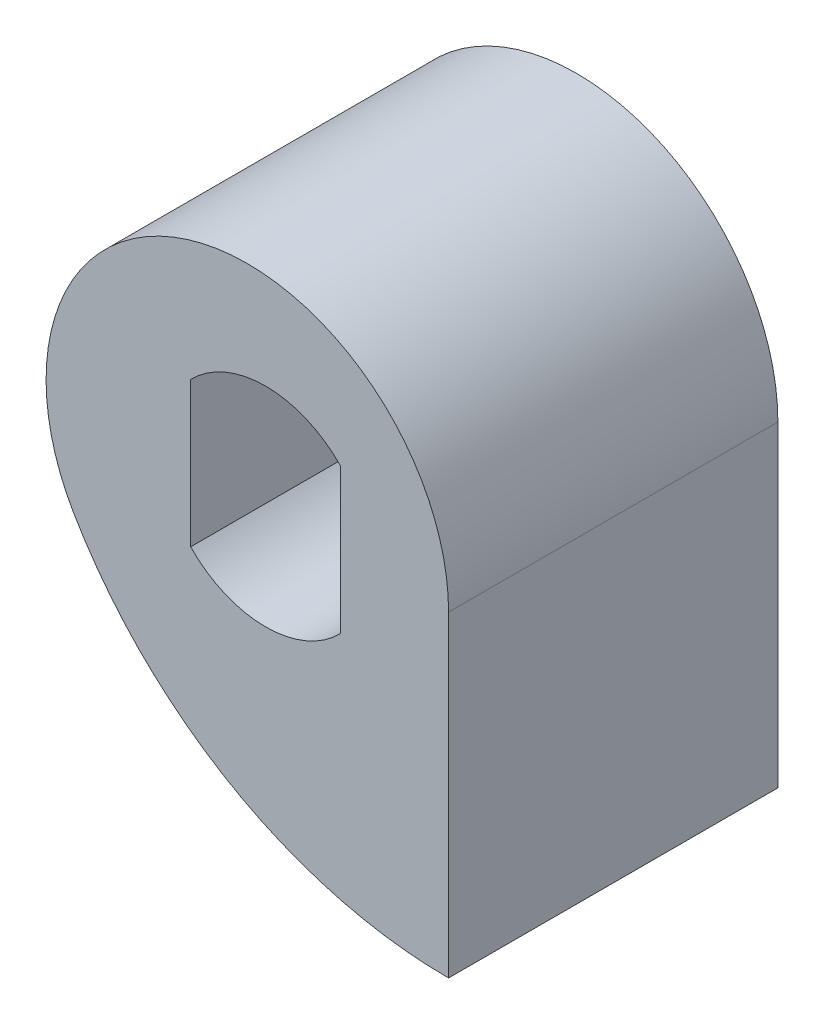
ISO-10303-21;
HEADER;
FILE_DESCRIPTION(('STEP AP214'),'2;1');
FILE_NAME('part.step','',(''),(''),'','','');
FILE_SCHEMA(('AUTOMOTIVE_DESIGN { 1 0 10303 214 1 1 1 1 }'));
ENDSEC;
DATA;
#1=APPLICATION_CONTEXT('core data for automotive mechanical design processes');
#2=APPLICATION_PROTOCOL_DEFINITION('international standard','automotive_design',2000,#1);
#3=PRODUCT_CONTEXT('',#1,'mechanical');
#4=PRODUCT('Part','Part','',(#3));
#5=PRODUCT_RELATED_PRODUCT_CATEGORY('part','',(#4));
#6=PRODUCT_DEFINITION_FORMATION('','',#4);
#7=PRODUCT_DEFINITION_CONTEXT('part definition',#1,'design');
#8=PRODUCT_DEFINITION('design','',#6,#7);
#9=PRODUCT_DEFINITION_SHAPE('','',#8);
#10=(LENGTH_UNIT() NAMED_UNIT(*) SI_UNIT(.MILLI.,.METRE.));
#11=(NAMED_UNIT(*) PLANE_ANGLE_UNIT() SI_UNIT($,.RADIAN.));
#12=(NAMED_UNIT(*) SI_UNIT($,.STERADIAN.) SOLID_ANGLE_UNIT());
#13=UNCERTAINTY_MEASURE_WITH_UNIT(LENGTH_MEASURE(1.E-05),#10,'distance_accuracy_value','');
#14=(GEOMETRIC_REPRESENTATION_CONTEXT(3) GLOBAL_UNCERTAINTY_ASSIGNED_CONTEXT((#13)) GLOBAL_UNIT_ASSIGNED_CONTEXT((#10,
#11,#12)) REPRESENTATION_CONTEXT('',''));
#15=CARTESIAN_POINT('',(0.,0.,0.));
#16=DIRECTION('',(0.,0.,1.));
#17=DIRECTION('',(1.,0.,0.));
#18=AXIS2_PLACEMENT_3D('',#15,#16,#17);
#19=CARTESIAN_POINT('',(-0.5,0.,-4.5));
#20=DIRECTION('',(0.,0.,1.));
#21=DIRECTION('',(1.,0.,0.));
#22=AXIS2_PLACEMENT_3D('',#19,#20,#21);
#23=CYLINDRICAL_SURFACE('',#22,5.5);
#24=DIRECTION('',(0.,0.,1.));
#25=VECTOR('',#24,1.);
#26=CARTESIAN_POINT('',(-5.25170595263659,-2.76970946846018,-4.5));
#27=LINE('',#26,#25);
#28=CARTESIAN_POINT('',(-5.25170595263659,-2.76970946846018,-4.5));
#29=VERTEX_POINT('',#28);
#30=CARTESIAN_POINT('',(-5.25170595263659,-2.76970946846018,4.5));
#31=VERTEX_POINT('',#30);
#32=EDGE_CURVE('E38',#29,#31,#27,.T.);
#33=ORIENTED_EDGE('',*,*,#32,.T.);
#34=CARTESIAN_POINT('',(-0.5,0.,4.5));
#35=DIRECTION('',(0.,0.,1.));
#36=DIRECTION('',(-1.,0.,0.));
#37=AXIS2_PLACEMENT_3D('',#34,#35,#36);
#38=CIRCLE('',#37,5.5);
#39=CARTESIAN_POINT('',(5.,0.,4.5));
#40=VERTEX_POINT('',#39);
#41=EDGE_CURVE('E124',#40,#31,#38,.T.);
#42=ORIENTED_EDGE('',*,*,#41,.F.);
#43=DIRECTION('',(0.,0.,1.));
#44=VECTOR('',#43,1.);
#45=CARTESIAN_POINT('',(5.,0.,-4.5));
#46=LINE('',#45,#44);
#47=CARTESIAN_POINT('',(5.,0.,-4.5));
#48=VERTEX_POINT('',#47);
#49=EDGE_CURVE('E11',#48,#40,#46,.T.);
#50=ORIENTED_EDGE('',*,*,#49,.F.);
#51=CARTESIAN_POINT('',(-0.5,0.,-4.5));
#52=DIRECTION('',(0.,0.,1.));
#53=DIRECTION('',(-1.,0.,0.));
#54=AXIS2_PLACEMENT_3D('',#51,#52,#53);
#55=CIRCLE('',#54,5.5);
#56=EDGE_CURVE('E140',#48,#29,#55,.T.);
#57=ORIENTED_EDGE('',*,*,#56,.T.);
#58=EDGE_LOOP('',(#33,#42,#50,#57));
#59=FACE_BOUND('',#58,.T.);
#60=ADVANCED_FACE('F35',(#59),#23,.T.);
#61=CARTESIAN_POINT('',(5.,0.,-4.5));
#62=DIRECTION('',(1.,0.,0.));
#63=DIRECTION('',(0.,1.,0.));
#64=AXIS2_PLACEMENT_3D('',#61,#62,#63);
#65=PLANE('',#64);
#66=ORIENTED_EDGE('',*,*,#49,.T.);
#67=DIRECTION('',(0.,1.,0.));
#68=VECTOR('',#67,1.);
#69=CARTESIAN_POINT('',(5.,0.,4.5));
#70=LINE('',#69,#68);
#71=CARTESIAN_POINT('',(5.,-8.66025403784439,4.5));
#72=VERTEX_POINT('',#71);
#73=EDGE_CURVE('E130',#72,#40,#70,.T.);
#74=ORIENTED_EDGE('',*,*,#73,.F.);
#75=DIRECTION('',(0.,0.,1.));
#76=VECTOR('',#75,1.);
#77=CARTESIAN_POINT('',(5.,-8.66025403784439,-4.5));
#78=LINE('',#77,#76);
#79=CARTESIAN_POINT('',(5.,-8.66025403784439,-4.5));
#80=VERTEX_POINT('',#79);
#81=EDGE_CURVE('E43',#80,#72,#78,.T.);
#82=ORIENTED_EDGE('',*,*,#81,.F.);
#83=DIRECTION('',(0.,1.,0.));
#84=VECTOR('',#83,1.);
#85=CARTESIAN_POINT('',(5.,0.,-4.5));
#86=LINE('',#85,#84);
#87=EDGE_CURVE('E148',#80,#48,#86,.T.);
#88=ORIENTED_EDGE('',*,*,#87,.T.);
#89=EDGE_LOOP('',(#66,#74,#82,#88));
#90=FACE_BOUND('',#89,.T.);
#91=ADVANCED_FACE('F157',(#90),#65,.T.);
#92=CARTESIAN_POINT('',(5.,3.20588063074029,-4.5));
#93=DIRECTION('',(0.,0.,1.));
#94=DIRECTION('',(1.,0.,0.));
#95=AXIS2_PLACEMENT_3D('',#92,#93,#94);
#96=CYLINDRICAL_SURFACE('',#95,11.8661346685847);
#97=ORIENTED_EDGE('',*,*,#81,.T.);
#98=CARTESIAN_POINT('',(5.,3.20588063074029,4.5));
#99=DIRECTION('',(0.,0.,1.));
#100=DIRECTION('',(-1.,0.,0.));
#101=AXIS2_PLACEMENT_3D('',#98,#99,#100);
#102=CIRCLE('',#101,11.8661346685847);
#103=EDGE_CURVE('E127',#31,#72,#102,.T.);
#104=ORIENTED_EDGE('',*,*,#103,.F.);
#105=ORIENTED_EDGE('',*,*,#32,.F.);
#106=CARTESIAN_POINT('',(5.,3.20588063074029,-4.5));
#107=DIRECTION('',(0.,0.,1.));
#108=DIRECTION('',(-1.,0.,0.));
#109=AXIS2_PLACEMENT_3D('',#106,#107,#108);
#110=CIRCLE('',#109,11.8661346685847);
#111=EDGE_CURVE('E145',#29,#80,#110,.T.);
#112=ORIENTED_EDGE('',*,*,#111,.T.);
#113=EDGE_LOOP('',(#97,#104,#105,#112));
#114=FACE_BOUND('',#113,.T.);
#115=ADVANCED_FACE('F153',(#114),#96,.T.);
#116=CARTESIAN_POINT('',(-0.5,0.,-4.5));
#117=DIRECTION('',(0.,0.,-1.));
#118=DIRECTION('',(-1.,0.,0.));
#119=AXIS2_PLACEMENT_3D('',#116,#117,#118);
#120=PLANE('',#119);
#121=CARTESIAN_POINT('',(0.,0.,-4.5));
#122=DIRECTION('',(0.,0.,1.));
#123=DIRECTION('',(1.,0.,0.));
#124=AXIS2_PLACEMENT_3D('',#121,#122,#123);
#125=CIRCLE('',#124,2.85);
#126=CARTESIAN_POINT('',(2.05,1.97989898732233,-4.5));
#127=VERTEX_POINT('',#126);
#128=CARTESIAN_POINT('',(-2.05,1.97989898732233,-4.5));
#129=VERTEX_POINT('',#128);
#130=EDGE_CURVE('E133',#127,#129,#125,.T.);
#131=ORIENTED_EDGE('',*,*,#130,.T.);
#132=DIRECTION('',(0.,-1.,0.));
#133=VECTOR('',#132,1.);
#134=CARTESIAN_POINT('',(-2.05,1.97989898732233,-4.5));
#135=LINE('',#134,#133);
#136=CARTESIAN_POINT('',(-2.05,-1.97989898732233,-4.5));
#137=VERTEX_POINT('',#136);
#138=EDGE_CURVE('E101',#129,#137,#135,.T.);
#139=ORIENTED_EDGE('',*,*,#138,.T.);
#140=CARTESIAN_POINT('',(0.,0.,-4.5));
#141=DIRECTION('',(0.,0.,1.));
#142=DIRECTION('',(1.,0.,0.));
#143=AXIS2_PLACEMENT_3D('',#140,#141,#142);
#144=CIRCLE('',#143,2.85);
#145=CARTESIAN_POINT('',(2.05,-1.97989898732233,-4.5));
#146=VERTEX_POINT('',#145);
#147=EDGE_CURVE('E51',#137,#146,#144,.T.);
#148=ORIENTED_EDGE('',*,*,#147,.T.);
#149=DIRECTION('',(0.,1.,0.));
#150=VECTOR('',#149,1.);
#151=CARTESIAN_POINT('',(2.05,1.97989898732233,-4.5));
#152=LINE('',#151,#150);
#153=EDGE_CURVE('E106',#146,#127,#152,.T.);
#154=ORIENTED_EDGE('',*,*,#153,.T.);
#155=EDGE_LOOP('',(#131,#139,#148,#154));
#156=FACE_BOUND('',#155,.T.);
#157=ORIENTED_EDGE('',*,*,#56,.F.);
#158=ORIENTED_EDGE('',*,*,#87,.F.);
#159=ORIENTED_EDGE('',*,*,#111,.F.);
#160=EDGE_LOOP('',(#157,#158,#159));
#161=FACE_BOUND('',#160,.T.);
#162=ADVANCED_FACE('F160',(#156,#161),#120,.T.);
#163=CARTESIAN_POINT('',(0.,0.,-4.5));
#164=DIRECTION('',(0.,0.,1.));
#165=DIRECTION('',(1.,0.,0.));
#166=AXIS2_PLACEMENT_3D('',#163,#164,#165);
#167=CYLINDRICAL_SURFACE('',#166,2.85);
#168=DIRECTION('',(0.,0.,1.));
#169=VECTOR('',#168,1.);
#170=CARTESIAN_POINT('',(2.05,1.97989898732233,-4.5));
#171=LINE('',#170,#169);
#172=CARTESIAN_POINT('',(2.05,1.97989898732233,4.5));
#173=VERTEX_POINT('',#172);
#174=EDGE_CURVE('E111',#127,#173,#171,.T.);
#175=ORIENTED_EDGE('',*,*,#174,.T.);
#176=CARTESIAN_POINT('',(0.,0.,4.5));
#177=DIRECTION('',(0.,0.,1.));
#178=DIRECTION('',(1.,0.,0.));
#179=AXIS2_PLACEMENT_3D('',#176,#177,#178);
#180=CIRCLE('',#179,2.85);
#181=CARTESIAN_POINT('',(-2.05,1.97989898732233,4.5));
#182=VERTEX_POINT('',#181);
#183=EDGE_CURVE('E109',#173,#182,#180,.T.);
#184=ORIENTED_EDGE('',*,*,#183,.T.);
#185=DIRECTION('',(0.,0.,1.));
#186=VECTOR('',#185,1.);
#187=CARTESIAN_POINT('',(-2.05,1.97989898732233,-4.5));
#188=LINE('',#187,#186);
#189=EDGE_CURVE('E94',#129,#182,#188,.T.);
#190=ORIENTED_EDGE('',*,*,#189,.F.);
#191=ORIENTED_EDGE('',*,*,#130,.F.);
#192=EDGE_LOOP('',(#175,#184,#190,#191));
#193=FACE_BOUND('',#192,.T.);
#194=ADVANCED_FACE('F110',(#193),#167,.F.);
#195=CARTESIAN_POINT('',(2.05,1.97989898732233,-4.5));
#196=DIRECTION('',(1.,0.,0.));
#197=DIRECTION('',(0.,0.,-1.));
#198=AXIS2_PLACEMENT_3D('',#195,#196,#197);
#199=PLANE('',#198);
#200=DIRECTION('',(0.,0.,1.));
#201=VECTOR('',#200,1.);
#202=CARTESIAN_POINT('',(2.05,-1.97989898732233,-4.5));
#203=LINE('',#202,#201);
#204=CARTESIAN_POINT('',(2.05,-1.97989898732233,4.5));
#205=VERTEX_POINT('',#204);
#206=EDGE_CURVE('E141',#146,#205,#203,.T.);
#207=ORIENTED_EDGE('',*,*,#206,.T.);
#208=DIRECTION('',(0.,1.,0.));
#209=VECTOR('',#208,1.);
#210=CARTESIAN_POINT('',(2.05,1.97989898732233,4.5));
#211=LINE('',#210,#209);
#212=EDGE_CURVE('E120',#205,#173,#211,.T.);
#213=ORIENTED_EDGE('',*,*,#212,.T.);
#214=ORIENTED_EDGE('',*,*,#174,.F.);
#215=ORIENTED_EDGE('',*,*,#153,.F.);
#216=EDGE_LOOP('',(#207,#213,#214,#215));
#217=FACE_BOUND('',#216,.T.);
#218=ADVANCED_FACE('F168',(#217),#199,.F.);
#219=CARTESIAN_POINT('',(0.,0.,-4.5));
#220=DIRECTION('',(0.,0.,1.));
#221=DIRECTION('',(1.,0.,0.));
#222=AXIS2_PLACEMENT_3D('',#219,#220,#221);
#223=CYLINDRICAL_SURFACE('',#222,2.85);
#224=DIRECTION('',(0.,0.,1.));
#225=VECTOR('',#224,1.);
#226=CARTESIAN_POINT('',(-2.05,-1.97989898732233,-4.5));
#227=LINE('',#226,#225);
#228=CARTESIAN_POINT('',(-2.05,-1.97989898732233,4.5));
#229=VERTEX_POINT('',#228);
#230=EDGE_CURVE('E105',#137,#229,#227,.T.);
#231=ORIENTED_EDGE('',*,*,#230,.T.);
#232=CARTESIAN_POINT('',(0.,0.,4.5));
#233=DIRECTION('',(0.,0.,1.));
#234=DIRECTION('',(1.,0.,0.));
#235=AXIS2_PLACEMENT_3D('',#232,#233,#234);
#236=CIRCLE('',#235,2.85);
#237=EDGE_CURVE('E118',#229,#205,#236,.T.);
#238=ORIENTED_EDGE('',*,*,#237,.T.);
#239=ORIENTED_EDGE('',*,*,#206,.F.);
#240=ORIENTED_EDGE('',*,*,#147,.F.);
#241=EDGE_LOOP('',(#231,#238,#239,#240));
#242=FACE_BOUND('',#241,.T.);
#243=ADVANCED_FACE('F200',(#242),#223,.F.);
#244=CARTESIAN_POINT('',(-2.05,1.97989898732233,-4.5));
#245=DIRECTION('',(-1.,0.,0.));
#246=DIRECTION('',(0.,0.,1.));
#247=AXIS2_PLACEMENT_3D('',#244,#245,#246);
#248=PLANE('',#247);
#249=ORIENTED_EDGE('',*,*,#189,.T.);
#250=DIRECTION('',(0.,-1.,0.));
#251=VECTOR('',#250,1.);
#252=CARTESIAN_POINT('',(-2.05,1.97989898732233,4.5));
#253=LINE('',#252,#251);
#254=EDGE_CURVE('E98',#182,#229,#253,.T.);
#255=ORIENTED_EDGE('',*,*,#254,.T.);
#256=ORIENTED_EDGE('',*,*,#230,.F.);
#257=ORIENTED_EDGE('',*,*,#138,.F.);
#258=EDGE_LOOP('',(#249,#255,#256,#257));
#259=FACE_BOUND('',#258,.T.);
#260=ADVANCED_FACE('F96',(#259),#248,.F.);
#261=CARTESIAN_POINT('',(-0.5,0.,4.5));
#262=DIRECTION('',(0.,0.,-1.));
#263=DIRECTION('',(-1.,0.,0.));
#264=AXIS2_PLACEMENT_3D('',#261,#262,#263);
#265=PLANE('',#264);
#266=ORIENTED_EDGE('',*,*,#41,.T.);
#267=ORIENTED_EDGE('',*,*,#103,.T.);
#268=ORIENTED_EDGE('',*,*,#73,.T.);
#269=EDGE_LOOP('',(#266,#267,#268));
#270=FACE_BOUND('',#269,.T.);
#271=ORIENTED_EDGE('',*,*,#183,.F.);
#272=ORIENTED_EDGE('',*,*,#212,.F.);
#273=ORIENTED_EDGE('',*,*,#237,.F.);
#274=ORIENTED_EDGE('',*,*,#254,.F.);
#275=EDGE_LOOP('',(#271,#272,#273,#274));
#276=FACE_BOUND('',#275,.T.);
#277=ADVANCED_FACE('F116',(#270,#276),#265,.F.);
#278=CLOSED_SHELL('',(#60,#91,#115,#162,#194,#218,#243,#260,#277));
#279=MANIFOLD_SOLID_BREP('B2',#278);
#280=ADVANCED_BREP_SHAPE_REPRESENTATION('',(#18,#279),#14);
#281=SHAPE_DEFINITION_REPRESENTATION(#9,#280);
ENDSEC;
END-ISO-10303-21;
